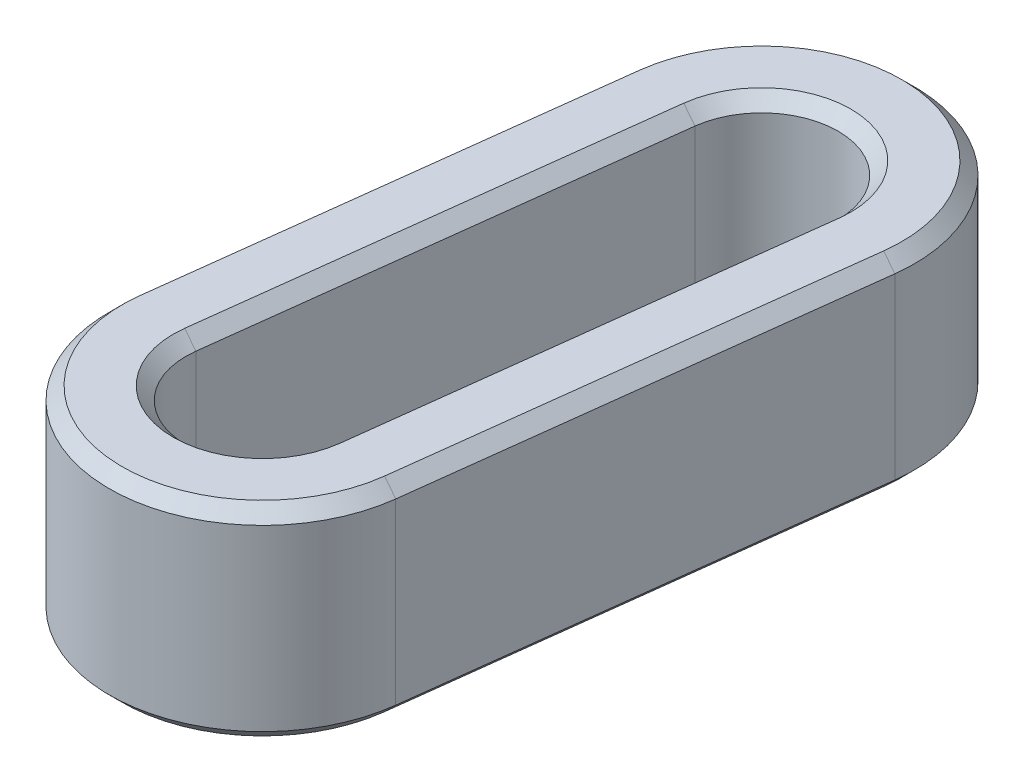
ISO-10303-21;
HEADER;
FILE_DESCRIPTION(('STEP AP214'),'2;1');
FILE_NAME('part.step','',(''),(''),'','','');
FILE_SCHEMA(('AUTOMOTIVE_DESIGN { 1 0 10303 214 1 1 1 1 }'));
ENDSEC;
DATA;
#1=APPLICATION_CONTEXT('core data for automotive mechanical design processes');
#2=APPLICATION_PROTOCOL_DEFINITION('international standard','automotive_design',2000,#1);
#3=PRODUCT_CONTEXT('',#1,'mechanical');
#4=PRODUCT('Part','Part','',(#3));
#5=PRODUCT_RELATED_PRODUCT_CATEGORY('part','',(#4));
#6=PRODUCT_DEFINITION_FORMATION('','',#4);
#7=PRODUCT_DEFINITION_CONTEXT('part definition',#1,'design');
#8=PRODUCT_DEFINITION('design','',#6,#7);
#9=PRODUCT_DEFINITION_SHAPE('','',#8);
#10=(LENGTH_UNIT() NAMED_UNIT(*) SI_UNIT(.MILLI.,.METRE.));
#11=(NAMED_UNIT(*) PLANE_ANGLE_UNIT() SI_UNIT($,.RADIAN.));
#12=(NAMED_UNIT(*) SI_UNIT($,.STERADIAN.) SOLID_ANGLE_UNIT());
#13=UNCERTAINTY_MEASURE_WITH_UNIT(LENGTH_MEASURE(1.E-05),#10,'distance_accuracy_value','');
#14=(GEOMETRIC_REPRESENTATION_CONTEXT(3) GLOBAL_UNCERTAINTY_ASSIGNED_CONTEXT((#13)) GLOBAL_UNIT_ASSIGNED_CONTEXT((#10,
#11,#12)) REPRESENTATION_CONTEXT('',''));
#15=CARTESIAN_POINT('',(0.,0.,0.));
#16=DIRECTION('',(0.,0.,1.));
#17=DIRECTION('',(1.,0.,0.));
#18=AXIS2_PLACEMENT_3D('',#15,#16,#17);
#19=CARTESIAN_POINT('',(-23.4671710635772,8.,81.1243251414921));
#20=DIRECTION('',(0.,1.,0.));
#21=DIRECTION('',(0.,0.,1.));
#22=AXIS2_PLACEMENT_3D('',#19,#20,#21);
#23=PLANE('',#22);
#24=DIRECTION('',(-0.121869343405148,0.,0.992546151641322));
#25=VECTOR('',#24,1.);
#26=CARTESIAN_POINT('',(-19.9932595328326,8.,81.5508678434101));
#27=LINE('',#26,#25);
#28=CARTESIAN_POINT('',(-17.8541251808342,8.,64.1290166247537));
#29=VERTEX_POINT('',#28);
#30=CARTESIAN_POINT('',(-19.9932595328326,8.,81.5508678434101));
#31=VERTEX_POINT('',#30);
#32=EDGE_CURVE('E42',#29,#31,#27,.T.);
#33=ORIENTED_EDGE('',*,*,#32,.T.);
#34=CARTESIAN_POINT('',(-23.4671710635772,8.,81.1243251414921));
#35=DIRECTION('',(0.,1.,0.));
#36=DIRECTION('',(0.,0.,1.));
#37=AXIS2_PLACEMENT_3D('',#34,#35,#36);
#38=CIRCLE('',#37,3.49999999999999);
#39=CARTESIAN_POINT('',(-26.9410825943219,8.,80.697782439574));
#40=VERTEX_POINT('',#39);
#41=EDGE_CURVE('E11',#31,#40,#38,.F.);
#42=ORIENTED_EDGE('',*,*,#41,.T.);
#43=DIRECTION('',(0.121869343405148,0.,-0.992546151641322));
#44=VECTOR('',#43,1.);
#45=CARTESIAN_POINT('',(-26.9410825943219,8.,80.697782439574));
#46=LINE('',#45,#44);
#47=CARTESIAN_POINT('',(-24.8019482423234,8.,63.2759312209177));
#48=VERTEX_POINT('',#47);
#49=EDGE_CURVE('E229',#40,#48,#46,.T.);
#50=ORIENTED_EDGE('',*,*,#49,.T.);
#51=CARTESIAN_POINT('',(-21.3280367115788,8.,63.7024739228357));
#52=DIRECTION('',(0.,1.,0.));
#53=DIRECTION('',(0.,0.,1.));
#54=AXIS2_PLACEMENT_3D('',#51,#52,#53);
#55=CIRCLE('',#54,3.49999999999999);
#56=EDGE_CURVE('E53',#48,#29,#55,.F.);
#57=ORIENTED_EDGE('',*,*,#56,.T.);
#58=EDGE_LOOP('',(#33,#42,#50,#57));
#59=FACE_BOUND('',#58,.T.);
#60=CARTESIAN_POINT('',(-21.3280367115788,8.,63.7024739228357));
#61=DIRECTION('',(0.,1.,0.));
#62=DIRECTION('',(0.,0.,1.));
#63=AXIS2_PLACEMENT_3D('',#60,#61,#62);
#64=CIRCLE('',#63,5.5);
#65=CARTESIAN_POINT('',(-15.8690328775515,8.,64.372755311564));
#66=VERTEX_POINT('',#65);
#67=CARTESIAN_POINT('',(-26.7870405456061,8.,63.0321925341074));
#68=VERTEX_POINT('',#67);
#69=EDGE_CURVE('E224',#66,#68,#64,.T.);
#70=ORIENTED_EDGE('',*,*,#69,.T.);
#71=DIRECTION('',(-0.121869343405148,0.,0.992546151641322));
#72=VECTOR('',#71,1.);
#73=CARTESIAN_POINT('',(-28.9261748976045,8.,80.4540437527637));
#74=LINE('',#73,#72);
#75=CARTESIAN_POINT('',(-28.9261748976045,8.,80.4540437527637));
#76=VERTEX_POINT('',#75);
#77=EDGE_CURVE('E226',#68,#76,#74,.T.);
#78=ORIENTED_EDGE('',*,*,#77,.T.);
#79=CARTESIAN_POINT('',(-23.4671710635772,8.,81.1243251414921));
#80=DIRECTION('',(0.,1.,0.));
#81=DIRECTION('',(0.,0.,1.));
#82=AXIS2_PLACEMENT_3D('',#79,#80,#81);
#83=CIRCLE('',#82,5.49999999999999);
#84=CARTESIAN_POINT('',(-18.00816722955,8.,81.7946065302204));
#85=VERTEX_POINT('',#84);
#86=EDGE_CURVE('E220',#76,#85,#83,.T.);
#87=ORIENTED_EDGE('',*,*,#86,.T.);
#88=DIRECTION('',(0.121869343405149,0.,-0.992546151641322));
#89=VECTOR('',#88,1.);
#90=CARTESIAN_POINT('',(-15.8690328775515,8.,64.372755311564));
#91=LINE('',#90,#89);
#92=EDGE_CURVE('E222',#85,#66,#91,.T.);
#93=ORIENTED_EDGE('',*,*,#92,.T.);
#94=EDGE_LOOP('',(#70,#78,#87,#93));
#95=FACE_BOUND('',#94,.T.);
#96=ADVANCED_FACE('F33',(#59,#95),#23,.T.);
#97=CARTESIAN_POINT('',(-23.4671710635772,0.,81.1243251414921));
#98=DIRECTION('',(0.,1.,0.));
#99=DIRECTION('',(0.,0.,1.));
#100=AXIS2_PLACEMENT_3D('',#97,#98,#99);
#101=PLANE('',#100);
#102=CARTESIAN_POINT('',(-23.4671710635772,0.,81.1243251414921));
#103=DIRECTION('',(0.,1.,0.));
#104=DIRECTION('',(0.,0.,1.));
#105=AXIS2_PLACEMENT_3D('',#102,#103,#104);
#106=CIRCLE('',#105,3.49999999999999);
#107=CARTESIAN_POINT('',(-26.9410825943219,0.,80.697782439574));
#108=VERTEX_POINT('',#107);
#109=CARTESIAN_POINT('',(-19.9932595328326,0.,81.5508678434101));
#110=VERTEX_POINT('',#109);
#111=EDGE_CURVE('E181',#108,#110,#106,.T.);
#112=ORIENTED_EDGE('',*,*,#111,.T.);
#113=DIRECTION('',(0.121869343405148,0.,-0.992546151641322));
#114=VECTOR('',#113,1.);
#115=CARTESIAN_POINT('',(-17.8541251808342,0.,64.1290166247537));
#116=LINE('',#115,#114);
#117=CARTESIAN_POINT('',(-17.8541251808342,0.,64.1290166247537));
#118=VERTEX_POINT('',#117);
#119=EDGE_CURVE('E183',#110,#118,#116,.T.);
#120=ORIENTED_EDGE('',*,*,#119,.T.);
#121=CARTESIAN_POINT('',(-21.3280367115788,0.,63.7024739228357));
#122=DIRECTION('',(0.,1.,0.));
#123=DIRECTION('',(0.,0.,1.));
#124=AXIS2_PLACEMENT_3D('',#121,#122,#123);
#125=CIRCLE('',#124,3.5);
#126=CARTESIAN_POINT('',(-24.8019482423234,0.,63.2759312209177));
#127=VERTEX_POINT('',#126);
#128=EDGE_CURVE('E173',#118,#127,#125,.T.);
#129=ORIENTED_EDGE('',*,*,#128,.T.);
#130=DIRECTION('',(-0.121869343405148,0.,0.992546151641322));
#131=VECTOR('',#130,1.);
#132=CARTESIAN_POINT('',(-26.9410825943219,0.,80.697782439574));
#133=LINE('',#132,#131);
#134=EDGE_CURVE('E175',#127,#108,#133,.T.);
#135=ORIENTED_EDGE('',*,*,#134,.T.);
#136=EDGE_LOOP('',(#112,#120,#129,#135));
#137=FACE_BOUND('',#136,.T.);
#138=CARTESIAN_POINT('',(-21.3280367115788,0.,63.7024739228357));
#139=DIRECTION('',(0.,1.,0.));
#140=DIRECTION('',(0.,0.,1.));
#141=AXIS2_PLACEMENT_3D('',#138,#139,#140);
#142=CIRCLE('',#141,5.5);
#143=CARTESIAN_POINT('',(-26.7870405456061,0.,63.0321925341074));
#144=VERTEX_POINT('',#143);
#145=CARTESIAN_POINT('',(-15.8690328775515,0.,64.372755311564));
#146=VERTEX_POINT('',#145);
#147=EDGE_CURVE('E172',#144,#146,#142,.F.);
#148=ORIENTED_EDGE('',*,*,#147,.T.);
#149=DIRECTION('',(-0.121869343405149,0.,0.992546151641322));
#150=VECTOR('',#149,1.);
#151=CARTESIAN_POINT('',(-18.00816722955,0.,81.7946065302204));
#152=LINE('',#151,#150);
#153=CARTESIAN_POINT('',(-18.00816722955,0.,81.7946065302204));
#154=VERTEX_POINT('',#153);
#155=EDGE_CURVE('E151',#146,#154,#152,.T.);
#156=ORIENTED_EDGE('',*,*,#155,.T.);
#157=CARTESIAN_POINT('',(-23.4671710635772,0.,81.1243251414921));
#158=DIRECTION('',(0.,1.,0.));
#159=DIRECTION('',(0.,0.,1.));
#160=AXIS2_PLACEMENT_3D('',#157,#158,#159);
#161=CIRCLE('',#160,5.49999999999999);
#162=CARTESIAN_POINT('',(-28.9261748976045,0.,80.4540437527637));
#163=VERTEX_POINT('',#162);
#164=EDGE_CURVE('E161',#154,#163,#161,.F.);
#165=ORIENTED_EDGE('',*,*,#164,.T.);
#166=DIRECTION('',(0.121869343405148,0.,-0.992546151641322));
#167=VECTOR('',#166,1.);
#168=CARTESIAN_POINT('',(-28.9261748976045,0.,80.4540437527637));
#169=LINE('',#168,#167);
#170=EDGE_CURVE('E167',#163,#144,#169,.T.);
#171=ORIENTED_EDGE('',*,*,#170,.T.);
#172=EDGE_LOOP('',(#148,#156,#165,#171));
#173=FACE_BOUND('',#172,.T.);
#174=ADVANCED_FACE('F170',(#137,#173),#101,.F.);
#175=CARTESIAN_POINT('',(-23.4671710635772,8.,81.1243251414921));
#176=DIRECTION('',(0.,-1.,0.));
#177=DIRECTION('',(0.,0.,-1.));
#178=AXIS2_PLACEMENT_3D('',#175,#176,#177);
#179=CYLINDRICAL_SURFACE('',#178,5.99999999999999);
#180=DIRECTION('',(0.,-1.,0.));
#181=VECTOR('',#180,1.);
#182=CARTESIAN_POINT('',(-29.4224479734252,8.,80.3931090810612));
#183=LINE('',#182,#181);
#184=CARTESIAN_POINT('',(-29.4224479734252,7.50000000000001,80.3931090810612));
#185=VERTEX_POINT('',#184);
#186=CARTESIAN_POINT('',(-29.4224479734252,0.5,80.3931090810612));
#187=VERTEX_POINT('',#186);
#188=EDGE_CURVE('E304',#185,#187,#183,.T.);
#189=ORIENTED_EDGE('',*,*,#188,.T.);
#190=CARTESIAN_POINT('',(-23.4671710635772,0.5,81.1243251414921));
#191=DIRECTION('',(0.,1.,0.));
#192=DIRECTION('',(0.,0.,1.));
#193=AXIS2_PLACEMENT_3D('',#190,#191,#192);
#194=CIRCLE('',#193,5.99999999999999);
#195=CARTESIAN_POINT('',(-17.5118941537293,0.5,81.8555412019229));
#196=VERTEX_POINT('',#195);
#197=EDGE_CURVE('E218',#187,#196,#194,.T.);
#198=ORIENTED_EDGE('',*,*,#197,.T.);
#199=DIRECTION('',(0.,-1.,0.));
#200=VECTOR('',#199,1.);
#201=CARTESIAN_POINT('',(-17.5118941537293,8.,81.8555412019229));
#202=LINE('',#201,#200);
#203=CARTESIAN_POINT('',(-17.5118941537293,7.50000000000001,81.8555412019229));
#204=VERTEX_POINT('',#203);
#205=EDGE_CURVE('E168',#204,#196,#202,.T.);
#206=ORIENTED_EDGE('',*,*,#205,.F.);
#207=CARTESIAN_POINT('',(-23.4671710635772,7.50000000000001,81.1243251414921));
#208=DIRECTION('',(0.,1.,0.));
#209=DIRECTION('',(0.,0.,1.));
#210=AXIS2_PLACEMENT_3D('',#207,#208,#209);
#211=CIRCLE('',#210,5.99999999999999);
#212=EDGE_CURVE('E216',#204,#185,#211,.F.);
#213=ORIENTED_EDGE('',*,*,#212,.T.);
#214=EDGE_LOOP('',(#189,#198,#206,#213));
#215=FACE_BOUND('',#214,.T.);
#216=ADVANCED_FACE('F286',(#215),#179,.T.);
#217=CARTESIAN_POINT('',(-15.3727598017309,8.,64.4336899832666));
#218=DIRECTION('',(-0.992546151641322,0.,-0.121869343405149));
#219=DIRECTION('',(-0.121869343405149,0.,0.992546151641322));
#220=AXIS2_PLACEMENT_3D('',#217,#218,#219);
#221=PLANE('',#220);
#222=ORIENTED_EDGE('',*,*,#205,.T.);
#223=DIRECTION('',(0.121869343405149,0.,-0.992546151641322));
#224=VECTOR('',#223,1.);
#225=CARTESIAN_POINT('',(-15.3727598017309,0.5,64.4336899832666));
#226=LINE('',#225,#224);
#227=CARTESIAN_POINT('',(-15.3727598017309,0.5,64.4336899832666));
#228=VERTEX_POINT('',#227);
#229=EDGE_CURVE('E154',#196,#228,#226,.T.);
#230=ORIENTED_EDGE('',*,*,#229,.T.);
#231=DIRECTION('',(0.,-1.,0.));
#232=VECTOR('',#231,1.);
#233=CARTESIAN_POINT('',(-15.3727598017309,8.,64.4336899832666));
#234=LINE('',#233,#232);
#235=CARTESIAN_POINT('',(-15.3727598017309,7.50000000000001,64.4336899832666));
#236=VERTEX_POINT('',#235);
#237=EDGE_CURVE('E283',#236,#228,#234,.T.);
#238=ORIENTED_EDGE('',*,*,#237,.F.);
#239=DIRECTION('',(-0.121869343405149,0.,0.992546151641322));
#240=VECTOR('',#239,1.);
#241=CARTESIAN_POINT('',(-17.5118941537293,7.50000000000001,81.8555412019229));
#242=LINE('',#241,#240);
#243=EDGE_CURVE('E204',#236,#204,#242,.T.);
#244=ORIENTED_EDGE('',*,*,#243,.T.);
#245=EDGE_LOOP('',(#222,#230,#238,#244));
#246=FACE_BOUND('',#245,.T.);
#247=ADVANCED_FACE('F281',(#246),#221,.F.);
#248=CARTESIAN_POINT('',(-21.3280367115788,8.,63.7024739228357));
#249=DIRECTION('',(0.,-1.,0.));
#250=DIRECTION('',(0.,0.,-1.));
#251=AXIS2_PLACEMENT_3D('',#248,#249,#250);
#252=CYLINDRICAL_SURFACE('',#251,6.);
#253=ORIENTED_EDGE('',*,*,#237,.T.);
#254=CARTESIAN_POINT('',(-21.3280367115788,0.5,63.7024739228357));
#255=DIRECTION('',(0.,1.,0.));
#256=DIRECTION('',(0.,0.,1.));
#257=AXIS2_PLACEMENT_3D('',#254,#255,#256);
#258=CIRCLE('',#257,6.);
#259=CARTESIAN_POINT('',(-27.2833136214267,0.5,62.9712578624048));
#260=VERTEX_POINT('',#259);
#261=EDGE_CURVE('E209',#228,#260,#258,.T.);
#262=ORIENTED_EDGE('',*,*,#261,.T.);
#263=DIRECTION('',(0.,-1.,0.));
#264=VECTOR('',#263,1.);
#265=CARTESIAN_POINT('',(-27.2833136214267,8.,62.9712578624048));
#266=LINE('',#265,#264);
#267=CARTESIAN_POINT('',(-27.2833136214267,7.50000000000001,62.9712578624048));
#268=VERTEX_POINT('',#267);
#269=EDGE_CURVE('E289',#268,#260,#266,.T.);
#270=ORIENTED_EDGE('',*,*,#269,.F.);
#271=CARTESIAN_POINT('',(-21.3280367115788,7.50000000000001,63.7024739228357));
#272=DIRECTION('',(0.,1.,0.));
#273=DIRECTION('',(0.,0.,1.));
#274=AXIS2_PLACEMENT_3D('',#271,#272,#273);
#275=CIRCLE('',#274,6.);
#276=EDGE_CURVE('E207',#268,#236,#275,.F.);
#277=ORIENTED_EDGE('',*,*,#276,.T.);
#278=EDGE_LOOP('',(#253,#262,#270,#277));
#279=FACE_BOUND('',#278,.T.);
#280=ADVANCED_FACE('F302',(#279),#252,.T.);
#281=CARTESIAN_POINT('',(-29.4224479734252,8.,80.3931090810612));
#282=DIRECTION('',(0.992546151641322,0.,0.121869343405148));
#283=DIRECTION('',(0.121869343405148,0.,-0.992546151641322));
#284=AXIS2_PLACEMENT_3D('',#281,#282,#283);
#285=PLANE('',#284);
#286=ORIENTED_EDGE('',*,*,#269,.T.);
#287=DIRECTION('',(-0.121869343405148,0.,0.992546151641322));
#288=VECTOR('',#287,1.);
#289=CARTESIAN_POINT('',(-29.4224479734252,0.5,80.3931090810612));
#290=LINE('',#289,#288);
#291=EDGE_CURVE('E214',#260,#187,#290,.T.);
#292=ORIENTED_EDGE('',*,*,#291,.T.);
#293=ORIENTED_EDGE('',*,*,#188,.F.);
#294=DIRECTION('',(0.121869343405148,0.,-0.992546151641322));
#295=VECTOR('',#294,1.);
#296=CARTESIAN_POINT('',(-27.2833136214267,7.50000000000001,62.9712578624048));
#297=LINE('',#296,#295);
#298=EDGE_CURVE('E211',#185,#268,#297,.T.);
#299=ORIENTED_EDGE('',*,*,#298,.T.);
#300=EDGE_LOOP('',(#286,#292,#293,#299));
#301=FACE_BOUND('',#300,.T.);
#302=ADVANCED_FACE('F373',(#301),#285,.F.);
#303=CARTESIAN_POINT('',(-21.3280367115788,8.,63.7024739228357));
#304=DIRECTION('',(0.,-1.,0.));
#305=DIRECTION('',(0.,0.,-1.));
#306=AXIS2_PLACEMENT_3D('',#303,#304,#305);
#307=CYLINDRICAL_SURFACE('',#306,3.);
#308=DIRECTION('',(0.,-1.,0.));
#309=VECTOR('',#308,1.);
#310=CARTESIAN_POINT('',(-24.3056751665027,8.,63.3368658926202));
#311=LINE('',#310,#309);
#312=CARTESIAN_POINT('',(-24.3056751665027,7.50000000000001,63.3368658926202));
#313=VERTEX_POINT('',#312);
#314=CARTESIAN_POINT('',(-24.3056751665027,0.499999999999997,63.3368658926202));
#315=VERTEX_POINT('',#314);
#316=EDGE_CURVE('E305',#313,#315,#311,.T.);
#317=ORIENTED_EDGE('',*,*,#316,.T.);
#318=CARTESIAN_POINT('',(-21.3280367115788,0.499999999999997,63.7024739228357));
#319=DIRECTION('',(0.,1.,0.));
#320=DIRECTION('',(0.,0.,1.));
#321=AXIS2_PLACEMENT_3D('',#318,#319,#320);
#322=CIRCLE('',#321,3.);
#323=CARTESIAN_POINT('',(-18.3503982566548,0.499999999999997,64.0680819530511));
#324=VERTEX_POINT('',#323);
#325=EDGE_CURVE('E202',#315,#324,#322,.F.);
#326=ORIENTED_EDGE('',*,*,#325,.T.);
#327=DIRECTION('',(0.,-1.,0.));
#328=VECTOR('',#327,1.);
#329=CARTESIAN_POINT('',(-18.3503982566548,8.,64.0680819530511));
#330=LINE('',#329,#328);
#331=CARTESIAN_POINT('',(-18.3503982566548,7.50000000000001,64.0680819530511));
#332=VERTEX_POINT('',#331);
#333=EDGE_CURVE('E243',#332,#324,#330,.T.);
#334=ORIENTED_EDGE('',*,*,#333,.F.);
#335=CARTESIAN_POINT('',(-21.3280367115788,7.50000000000001,63.7024739228357));
#336=DIRECTION('',(0.,1.,0.));
#337=DIRECTION('',(0.,0.,1.));
#338=AXIS2_PLACEMENT_3D('',#335,#336,#337);
#339=CIRCLE('',#338,3.);
#340=EDGE_CURVE('E200',#332,#313,#339,.T.);
#341=ORIENTED_EDGE('',*,*,#340,.T.);
#342=EDGE_LOOP('',(#317,#326,#334,#341));
#343=FACE_BOUND('',#342,.T.);
#344=ADVANCED_FACE('F370',(#343),#307,.F.);
#345=CARTESIAN_POINT('',(-26.4448095185012,8.,80.7587171112766));
#346=DIRECTION('',(0.992546151641322,0.,0.121869343405148));
#347=DIRECTION('',(0.121869343405148,0.,-0.992546151641322));
#348=AXIS2_PLACEMENT_3D('',#345,#346,#347);
#349=PLANE('',#348);
#350=DIRECTION('',(0.,-1.,0.));
#351=VECTOR('',#350,1.);
#352=CARTESIAN_POINT('',(-26.4448095185012,8.,80.7587171112766));
#353=LINE('',#352,#351);
#354=CARTESIAN_POINT('',(-26.4448095185012,7.50000000000001,80.7587171112766));
#355=VERTEX_POINT('',#354);
#356=CARTESIAN_POINT('',(-26.4448095185012,0.499999999999996,80.7587171112766));
#357=VERTEX_POINT('',#356);
#358=EDGE_CURVE('E310',#355,#357,#353,.T.);
#359=ORIENTED_EDGE('',*,*,#358,.T.);
#360=DIRECTION('',(0.121869343405148,0.,-0.992546151641322));
#361=VECTOR('',#360,1.);
#362=CARTESIAN_POINT('',(-24.3056751665027,0.499999999999996,63.3368658926202));
#363=LINE('',#362,#361);
#364=EDGE_CURVE('E198',#357,#315,#363,.T.);
#365=ORIENTED_EDGE('',*,*,#364,.T.);
#366=ORIENTED_EDGE('',*,*,#316,.F.);
#367=DIRECTION('',(-0.121869343405148,0.,0.992546151641322));
#368=VECTOR('',#367,1.);
#369=CARTESIAN_POINT('',(-26.4448095185012,7.50000000000001,80.7587171112766));
#370=LINE('',#369,#368);
#371=EDGE_CURVE('E196',#313,#355,#370,.T.);
#372=ORIENTED_EDGE('',*,*,#371,.T.);
#373=EDGE_LOOP('',(#359,#365,#366,#372));
#374=FACE_BOUND('',#373,.T.);
#375=ADVANCED_FACE('F348',(#374),#349,.T.);
#376=CARTESIAN_POINT('',(-23.4671710635772,8.,81.1243251414921));
#377=DIRECTION('',(0.,-1.,0.));
#378=DIRECTION('',(0.,0.,-1.));
#379=AXIS2_PLACEMENT_3D('',#376,#377,#378);
#380=CYLINDRICAL_SURFACE('',#379,2.99999999999999);
#381=DIRECTION('',(0.,-1.,0.));
#382=VECTOR('',#381,1.);
#383=CARTESIAN_POINT('',(-20.4895326086533,8.,81.4899331717075));
#384=LINE('',#383,#382);
#385=CARTESIAN_POINT('',(-20.4895326086533,7.50000000000001,81.4899331717075));
#386=VERTEX_POINT('',#385);
#387=CARTESIAN_POINT('',(-20.4895326086533,0.499999999999997,81.4899331717075));
#388=VERTEX_POINT('',#387);
#389=EDGE_CURVE('E313',#386,#388,#384,.T.);
#390=ORIENTED_EDGE('',*,*,#389,.T.);
#391=CARTESIAN_POINT('',(-23.4671710635772,0.499999999999997,81.1243251414921));
#392=DIRECTION('',(0.,1.,0.));
#393=DIRECTION('',(0.,0.,1.));
#394=AXIS2_PLACEMENT_3D('',#391,#392,#393);
#395=CIRCLE('',#394,2.99999999999999);
#396=EDGE_CURVE('E194',#388,#357,#395,.F.);
#397=ORIENTED_EDGE('',*,*,#396,.T.);
#398=ORIENTED_EDGE('',*,*,#358,.F.);
#399=CARTESIAN_POINT('',(-23.4671710635772,7.50000000000001,81.1243251414921));
#400=DIRECTION('',(0.,1.,0.));
#401=DIRECTION('',(0.,0.,1.));
#402=AXIS2_PLACEMENT_3D('',#399,#400,#401);
#403=CIRCLE('',#402,2.99999999999999);
#404=EDGE_CURVE('E191',#355,#386,#403,.T.);
#405=ORIENTED_EDGE('',*,*,#404,.T.);
#406=EDGE_LOOP('',(#390,#397,#398,#405));
#407=FACE_BOUND('',#406,.T.);
#408=ADVANCED_FACE('F344',(#407),#380,.F.);
#409=CARTESIAN_POINT('',(-18.3503982566548,8.,64.0680819530511));
#410=DIRECTION('',(-0.992546151641322,0.,-0.121869343405148));
#411=DIRECTION('',(-0.121869343405148,0.,0.992546151641322));
#412=AXIS2_PLACEMENT_3D('',#409,#410,#411);
#413=PLANE('',#412);
#414=ORIENTED_EDGE('',*,*,#333,.T.);
#415=DIRECTION('',(-0.121869343405148,0.,0.992546151641322));
#416=VECTOR('',#415,1.);
#417=CARTESIAN_POINT('',(-20.4895326086533,0.499999999999997,81.4899331717075));
#418=LINE('',#417,#416);
#419=EDGE_CURVE('E188',#324,#388,#418,.T.);
#420=ORIENTED_EDGE('',*,*,#419,.T.);
#421=ORIENTED_EDGE('',*,*,#389,.F.);
#422=DIRECTION('',(0.121869343405148,0.,-0.992546151641322));
#423=VECTOR('',#422,1.);
#424=CARTESIAN_POINT('',(-18.3503982566548,7.50000000000001,64.0680819530511));
#425=LINE('',#424,#423);
#426=EDGE_CURVE('E186',#386,#332,#425,.T.);
#427=ORIENTED_EDGE('',*,*,#426,.T.);
#428=EDGE_LOOP('',(#414,#420,#421,#427));
#429=FACE_BOUND('',#428,.T.);
#430=ADVANCED_FACE('F320',(#429),#413,.T.);
#431=CARTESIAN_POINT('',(-26.9410825943219,0.,80.697782439574));
#432=DIRECTION('',(0.701836114466189,-0.707106781186549,0.0861746391405318));
#433=DIRECTION('',(0.121869343405148,0.,-0.992546151641322));
#434=AXIS2_PLACEMENT_3D('',#431,#432,#433);
#435=PLANE('',#434);
#436=DIRECTION('',(-0.701836114466193,-0.707106781186545,-0.086174639140523));
#437=VECTOR('',#436,1.);
#438=CARTESIAN_POINT('',(-24.3056751665027,0.499999999999996,63.3368658926202));
#439=LINE('',#438,#437);
#440=EDGE_CURVE('E237',#315,#127,#439,.T.);
#441=ORIENTED_EDGE('',*,*,#440,.F.);
#442=ORIENTED_EDGE('',*,*,#364,.F.);
#443=DIRECTION('',(0.701836114466192,0.707106781186544,0.0861746391405424));
#444=VECTOR('',#443,1.);
#445=CARTESIAN_POINT('',(-26.9410825943219,0.,80.697782439574));
#446=LINE('',#445,#444);
#447=EDGE_CURVE('E240',#108,#357,#446,.T.);
#448=ORIENTED_EDGE('',*,*,#447,.F.);
#449=ORIENTED_EDGE('',*,*,#134,.F.);
#450=EDGE_LOOP('',(#441,#442,#448,#449));
#451=FACE_BOUND('',#450,.T.);
#452=ADVANCED_FACE('F352',(#451),#435,.T.);
#453=CARTESIAN_POINT('',(-23.4671710635772,0.,81.1243251414921));
#454=DIRECTION('',(0.,-1.,0.));
#455=DIRECTION('',(0.,0.,-1.));
#456=AXIS2_PLACEMENT_3D('',#453,#454,#455);
#457=CONICAL_SURFACE('',#456,3.49999999999999,0.785398163397452);
#458=ORIENTED_EDGE('',*,*,#447,.T.);
#459=ORIENTED_EDGE('',*,*,#396,.F.);
#460=DIRECTION('',(-0.701836114466192,0.707106781186545,-0.0861746391405424));
#461=VECTOR('',#460,1.);
#462=CARTESIAN_POINT('',(-19.9932595328326,0.,81.5508678434101));
#463=LINE('',#462,#461);
#464=EDGE_CURVE('E235',#110,#388,#463,.T.);
#465=ORIENTED_EDGE('',*,*,#464,.F.);
#466=ORIENTED_EDGE('',*,*,#111,.F.);
#467=EDGE_LOOP('',(#458,#459,#465,#466));
#468=FACE_BOUND('',#467,.T.);
#469=ADVANCED_FACE('F341',(#468),#457,.F.);
#470=CARTESIAN_POINT('',(-21.3280367115788,0.,63.7024739228357));
#471=DIRECTION('',(0.,-1.,0.));
#472=DIRECTION('',(0.,0.,-1.));
#473=AXIS2_PLACEMENT_3D('',#470,#471,#472);
#474=CONICAL_SURFACE('',#473,3.5,0.785398163397451);
#475=ORIENTED_EDGE('',*,*,#440,.T.);
#476=ORIENTED_EDGE('',*,*,#128,.F.);
#477=DIRECTION('',(0.701836114466191,-0.707106781186545,0.0861746391405424));
#478=VECTOR('',#477,1.);
#479=CARTESIAN_POINT('',(-18.3503982566548,0.499999999999997,64.0680819530511));
#480=LINE('',#479,#478);
#481=EDGE_CURVE('E233',#324,#118,#480,.T.);
#482=ORIENTED_EDGE('',*,*,#481,.F.);
#483=ORIENTED_EDGE('',*,*,#325,.F.);
#484=EDGE_LOOP('',(#475,#476,#482,#483));
#485=FACE_BOUND('',#484,.T.);
#486=ADVANCED_FACE('F334',(#485),#474,.F.);
#487=CARTESIAN_POINT('',(-19.9932595328326,0.,81.5508678434101));
#488=DIRECTION('',(-0.701836114466189,-0.707106781186549,-0.0861746391405324));
#489=DIRECTION('',(-0.121869343405148,0.,0.992546151641322));
#490=AXIS2_PLACEMENT_3D('',#487,#488,#489);
#491=PLANE('',#490);
#492=ORIENTED_EDGE('',*,*,#464,.T.);
#493=ORIENTED_EDGE('',*,*,#419,.F.);
#494=ORIENTED_EDGE('',*,*,#481,.T.);
#495=ORIENTED_EDGE('',*,*,#119,.F.);
#496=EDGE_LOOP('',(#492,#493,#494,#495));
#497=FACE_BOUND('',#496,.T.);
#498=ADVANCED_FACE('F327',(#497),#491,.T.);
#499=CARTESIAN_POINT('',(-29.4224479734252,0.5,80.3931090810612));
#500=DIRECTION('',(0.70183611446619,0.707106781186548,0.0861746391405319));
#501=DIRECTION('',(-0.121869343405148,0.,0.992546151641322));
#502=AXIS2_PLACEMENT_3D('',#499,#500,#501);
#503=PLANE('',#502);
#504=DIRECTION('',(-0.701836114466193,0.707106781186546,-0.0861746391405223));
#505=VECTOR('',#504,1.);
#506=CARTESIAN_POINT('',(-26.7870405456061,0.,63.0321925341074));
#507=LINE('',#506,#505);
#508=EDGE_CURVE('E157',#144,#260,#507,.T.);
#509=ORIENTED_EDGE('',*,*,#508,.F.);
#510=ORIENTED_EDGE('',*,*,#170,.F.);
#511=DIRECTION('',(0.701836114466193,-0.707106781186546,0.0861746391405223));
#512=VECTOR('',#511,1.);
#513=CARTESIAN_POINT('',(-29.4224479734252,0.5,80.3931090810612));
#514=LINE('',#513,#512);
#515=EDGE_CURVE('E164',#187,#163,#514,.T.);
#516=ORIENTED_EDGE('',*,*,#515,.F.);
#517=ORIENTED_EDGE('',*,*,#291,.F.);
#518=EDGE_LOOP('',(#509,#510,#516,#517));
#519=FACE_BOUND('',#518,.T.);
#520=ADVANCED_FACE('F295',(#519),#503,.F.);
#521=CARTESIAN_POINT('',(-23.4671710635772,0.5,81.1243251414921));
#522=DIRECTION('',(0.,1.,0.));
#523=DIRECTION('',(0.,0.,1.));
#524=AXIS2_PLACEMENT_3D('',#521,#522,#523);
#525=CONICAL_SURFACE('',#524,5.99999999999999,0.785398163397448);
#526=ORIENTED_EDGE('',*,*,#515,.T.);
#527=ORIENTED_EDGE('',*,*,#164,.F.);
#528=DIRECTION('',(-0.701836114466186,-0.70710678118655,-0.0861746391405424));
#529=VECTOR('',#528,1.);
#530=CARTESIAN_POINT('',(-17.5118941537293,0.500000000000001,81.8555412019229));
#531=LINE('',#530,#529);
#532=EDGE_CURVE('E147',#196,#154,#531,.T.);
#533=ORIENTED_EDGE('',*,*,#532,.F.);
#534=ORIENTED_EDGE('',*,*,#197,.F.);
#535=EDGE_LOOP('',(#526,#527,#533,#534));
#536=FACE_BOUND('',#535,.T.);
#537=ADVANCED_FACE('F162',(#536),#525,.T.);
#538=CARTESIAN_POINT('',(-21.3280367115788,0.5,63.7024739228357));
#539=DIRECTION('',(0.,1.,0.));
#540=DIRECTION('',(0.,0.,1.));
#541=AXIS2_PLACEMENT_3D('',#538,#539,#540);
#542=CONICAL_SURFACE('',#541,6.,0.785398163397447);
#543=ORIENTED_EDGE('',*,*,#508,.T.);
#544=ORIENTED_EDGE('',*,*,#261,.F.);
#545=DIRECTION('',(0.701836114466188,0.707106781186549,0.0861746391405422));
#546=VECTOR('',#545,1.);
#547=CARTESIAN_POINT('',(-15.8690328775515,0.,64.372755311564));
#548=LINE('',#547,#546);
#549=EDGE_CURVE('E158',#146,#228,#548,.T.);
#550=ORIENTED_EDGE('',*,*,#549,.F.);
#551=ORIENTED_EDGE('',*,*,#147,.F.);
#552=EDGE_LOOP('',(#543,#544,#550,#551));
#553=FACE_BOUND('',#552,.T.);
#554=ADVANCED_FACE('F298',(#553),#542,.T.);
#555=CARTESIAN_POINT('',(-15.3727598017309,0.5,64.4336899832666));
#556=DIRECTION('',(-0.701836114466188,0.70710678118655,-0.0861746391405323));
#557=DIRECTION('',(0.121869343405149,0.,-0.992546151641322));
#558=AXIS2_PLACEMENT_3D('',#555,#556,#557);
#559=PLANE('',#558);
#560=ORIENTED_EDGE('',*,*,#532,.T.);
#561=ORIENTED_EDGE('',*,*,#155,.F.);
#562=ORIENTED_EDGE('',*,*,#549,.T.);
#563=ORIENTED_EDGE('',*,*,#229,.F.);
#564=EDGE_LOOP('',(#560,#561,#562,#563));
#565=FACE_BOUND('',#564,.T.);
#566=ADVANCED_FACE('F149',(#565),#559,.F.);
#567=CARTESIAN_POINT('',(-21.3280367115788,7.50000000000001,63.7024739228357));
#568=DIRECTION('',(0.,1.,0.));
#569=DIRECTION('',(0.,0.,1.));
#570=AXIS2_PLACEMENT_3D('',#567,#568,#569);
#571=CONICAL_SURFACE('',#570,3.,0.78539816339745);
#572=DIRECTION('',(-0.701836114466193,-0.707106781186546,-0.0861746391405235));
#573=VECTOR('',#572,1.);
#574=CARTESIAN_POINT('',(-17.8541251808342,8.,64.1290166247537));
#575=LINE('',#574,#573);
#576=EDGE_CURVE('E253',#29,#332,#575,.T.);
#577=ORIENTED_EDGE('',*,*,#576,.F.);
#578=ORIENTED_EDGE('',*,*,#56,.F.);
#579=DIRECTION('',(-0.701836114466193,0.707106781186546,-0.0861746391405235));
#580=VECTOR('',#579,1.);
#581=CARTESIAN_POINT('',(-24.3056751665027,7.50000000000001,63.3368658926202));
#582=LINE('',#581,#580);
#583=EDGE_CURVE('E244',#313,#48,#582,.T.);
#584=ORIENTED_EDGE('',*,*,#583,.F.);
#585=ORIENTED_EDGE('',*,*,#340,.F.);
#586=EDGE_LOOP('',(#577,#578,#584,#585));
#587=FACE_BOUND('',#586,.T.);
#588=ADVANCED_FACE('F417',(#587),#571,.F.);
#589=CARTESIAN_POINT('',(-26.4448095185012,7.50000000000001,80.7587171112766));
#590=DIRECTION('',(-0.701836114466189,-0.707106781186549,-0.0861746391405318));
#591=DIRECTION('',(-0.121869343405148,0.,0.992546151641322));
#592=AXIS2_PLACEMENT_3D('',#589,#590,#591);
#593=PLANE('',#592);
#594=ORIENTED_EDGE('',*,*,#583,.T.);
#595=ORIENTED_EDGE('',*,*,#49,.F.);
#596=DIRECTION('',(-0.701836114466193,0.707106781186546,-0.0861746391405235));
#597=VECTOR('',#596,1.);
#598=CARTESIAN_POINT('',(-26.4448095185012,7.50000000000001,80.7587171112766));
#599=LINE('',#598,#597);
#600=EDGE_CURVE('E251',#355,#40,#599,.T.);
#601=ORIENTED_EDGE('',*,*,#600,.F.);
#602=ORIENTED_EDGE('',*,*,#371,.F.);
#603=EDGE_LOOP('',(#594,#595,#601,#602));
#604=FACE_BOUND('',#603,.T.);
#605=ADVANCED_FACE('F423',(#604),#593,.F.);
#606=CARTESIAN_POINT('',(-18.3503982566548,7.50000000000001,64.0680819530511));
#607=DIRECTION('',(0.701836114466189,-0.707106781186549,0.0861746391405324));
#608=DIRECTION('',(0.121869343405148,0.,-0.992546151641322));
#609=AXIS2_PLACEMENT_3D('',#606,#607,#608);
#610=PLANE('',#609);
#611=ORIENTED_EDGE('',*,*,#576,.T.);
#612=ORIENTED_EDGE('',*,*,#426,.F.);
#613=DIRECTION('',(-0.701836114466193,-0.707106781186546,-0.0861746391405235));
#614=VECTOR('',#613,1.);
#615=CARTESIAN_POINT('',(-19.9932595328326,8.,81.5508678434101));
#616=LINE('',#615,#614);
#617=EDGE_CURVE('E249',#31,#386,#616,.T.);
#618=ORIENTED_EDGE('',*,*,#617,.F.);
#619=ORIENTED_EDGE('',*,*,#32,.F.);
#620=EDGE_LOOP('',(#611,#612,#618,#619));
#621=FACE_BOUND('',#620,.T.);
#622=ADVANCED_FACE('F431',(#621),#610,.F.);
#623=CARTESIAN_POINT('',(-23.4671710635772,7.50000000000001,81.1243251414921));
#624=DIRECTION('',(0.,1.,0.));
#625=DIRECTION('',(0.,0.,1.));
#626=AXIS2_PLACEMENT_3D('',#623,#624,#625);
#627=CONICAL_SURFACE('',#626,2.99999999999999,0.78539816339745);
#628=ORIENTED_EDGE('',*,*,#600,.T.);
#629=ORIENTED_EDGE('',*,*,#41,.F.);
#630=ORIENTED_EDGE('',*,*,#617,.T.);
#631=ORIENTED_EDGE('',*,*,#404,.F.);
#632=EDGE_LOOP('',(#628,#629,#630,#631));
#633=FACE_BOUND('',#632,.T.);
#634=ADVANCED_FACE('F439',(#633),#627,.F.);
#635=CARTESIAN_POINT('',(-18.00816722955,8.,81.7946065302204));
#636=DIRECTION('',(0.701836114466181,0.707106781186557,0.0861746391405315));
#637=DIRECTION('',(-0.121869343405149,0.,0.992546151641322));
#638=AXIS2_PLACEMENT_3D('',#635,#636,#637);
#639=PLANE('',#638);
#640=DIRECTION('',(-0.701836114466198,0.707106781186538,-0.0861746391405432));
#641=VECTOR('',#640,1.);
#642=CARTESIAN_POINT('',(-17.5118941537293,7.50000000000001,81.8555412019229));
#643=LINE('',#642,#641);
#644=EDGE_CURVE('E261',#204,#85,#643,.T.);
#645=ORIENTED_EDGE('',*,*,#644,.F.);
#646=ORIENTED_EDGE('',*,*,#243,.F.);
#647=DIRECTION('',(0.701836114466198,-0.707106781186541,0.0861746391405239));
#648=VECTOR('',#647,1.);
#649=CARTESIAN_POINT('',(-15.8690328775515,8.,64.372755311564));
#650=LINE('',#649,#648);
#651=EDGE_CURVE('E37',#66,#236,#650,.T.);
#652=ORIENTED_EDGE('',*,*,#651,.F.);
#653=ORIENTED_EDGE('',*,*,#92,.F.);
#654=EDGE_LOOP('',(#645,#646,#652,#653));
#655=FACE_BOUND('',#654,.T.);
#656=ADVANCED_FACE('F35',(#655),#639,.T.);
#657=CARTESIAN_POINT('',(-21.3280367115788,8.,63.7024739228357));
#658=DIRECTION('',(0.,-1.,0.));
#659=DIRECTION('',(0.,0.,-1.));
#660=AXIS2_PLACEMENT_3D('',#657,#658,#659);
#661=CONICAL_SURFACE('',#660,5.5,0.78539816339746);
#662=ORIENTED_EDGE('',*,*,#651,.T.);
#663=ORIENTED_EDGE('',*,*,#276,.F.);
#664=DIRECTION('',(-0.701836114466199,-0.707106781186539,-0.0861746391405237));
#665=VECTOR('',#664,1.);
#666=CARTESIAN_POINT('',(-26.7870405456061,8.,63.0321925341074));
#667=LINE('',#666,#665);
#668=EDGE_CURVE('E260',#68,#268,#667,.T.);
#669=ORIENTED_EDGE('',*,*,#668,.F.);
#670=ORIENTED_EDGE('',*,*,#69,.F.);
#671=EDGE_LOOP('',(#662,#663,#669,#670));
#672=FACE_BOUND('',#671,.T.);
#673=ADVANCED_FACE('F272',(#672),#661,.T.);
#674=CARTESIAN_POINT('',(-23.4671710635772,8.,81.1243251414921));
#675=DIRECTION('',(0.,-1.,0.));
#676=DIRECTION('',(0.,0.,-1.));
#677=AXIS2_PLACEMENT_3D('',#674,#675,#676);
#678=CONICAL_SURFACE('',#677,5.49999999999999,0.78539816339746);
#679=ORIENTED_EDGE('',*,*,#644,.T.);
#680=ORIENTED_EDGE('',*,*,#86,.F.);
#681=DIRECTION('',(0.701836114466202,0.707106781186537,0.0861746391405234));
#682=VECTOR('',#681,1.);
#683=CARTESIAN_POINT('',(-29.4224479734252,7.50000000000001,80.3931090810612));
#684=LINE('',#683,#682);
#685=EDGE_CURVE('E258',#185,#76,#684,.T.);
#686=ORIENTED_EDGE('',*,*,#685,.F.);
#687=ORIENTED_EDGE('',*,*,#212,.F.);
#688=EDGE_LOOP('',(#679,#680,#686,#687));
#689=FACE_BOUND('',#688,.T.);
#690=ADVANCED_FACE('F459',(#689),#678,.T.);
#691=CARTESIAN_POINT('',(-28.9261748976045,8.,80.4540437527637));
#692=DIRECTION('',(-0.701836114466181,0.707106781186557,-0.0861746391405308));
#693=DIRECTION('',(0.121869343405148,0.,-0.992546151641322));
#694=AXIS2_PLACEMENT_3D('',#691,#692,#693);
#695=PLANE('',#694);
#696=ORIENTED_EDGE('',*,*,#668,.T.);
#697=ORIENTED_EDGE('',*,*,#298,.F.);
#698=ORIENTED_EDGE('',*,*,#685,.T.);
#699=ORIENTED_EDGE('',*,*,#77,.F.);
#700=EDGE_LOOP('',(#696,#697,#698,#699));
#701=FACE_BOUND('',#700,.T.);
#702=ADVANCED_FACE('F465',(#701),#695,.T.);
#703=CLOSED_SHELL('',(#96,#174,#216,#247,#280,#302,#344,#375,#408,#430,#452,#469,#486,#498,#520,
#537,#554,#566,#588,#605,#622,#634,#656,#673,#690,#702));
#704=MANIFOLD_SOLID_BREP('B2',#703);
#705=ADVANCED_BREP_SHAPE_REPRESENTATION('',(#18,#704),#14);
#706=SHAPE_DEFINITION_REPRESENTATION(#9,#705);
ENDSEC;
END-ISO-10303-21;
